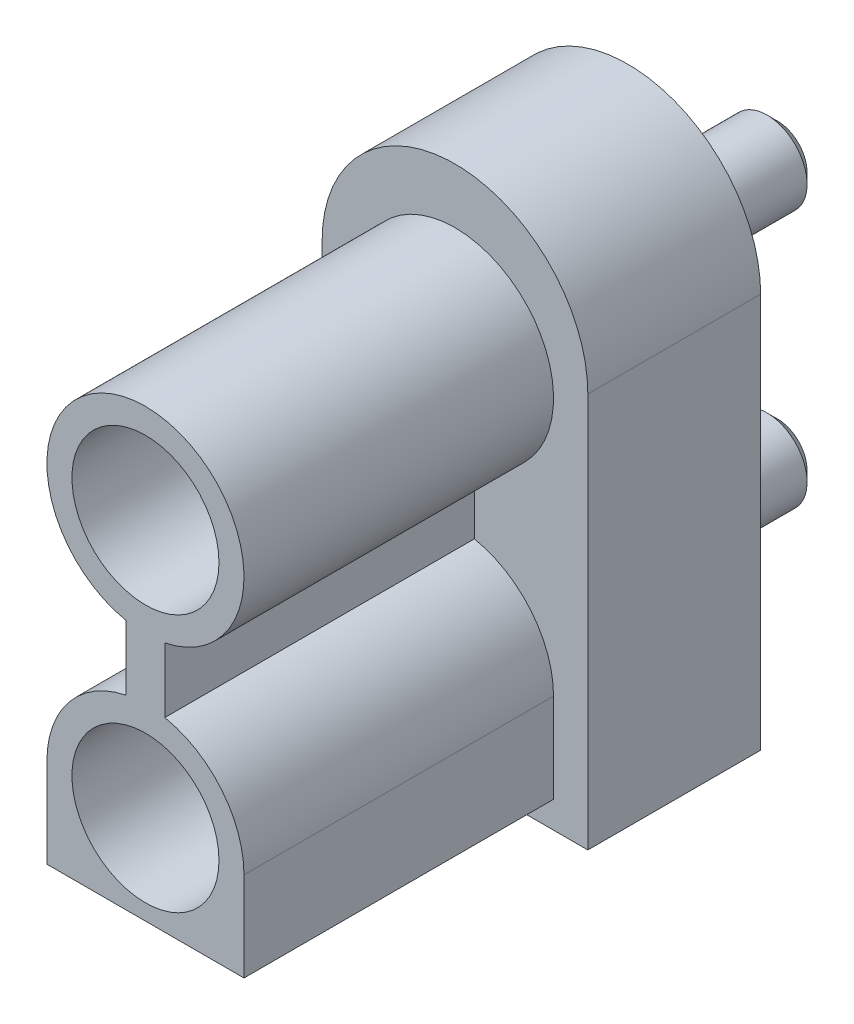
ISO-10303-21;
HEADER;
FILE_DESCRIPTION(('STEP AP214'),'2;1');
FILE_NAME('part.step','',(''),(''),'','','');
FILE_SCHEMA(('AUTOMOTIVE_DESIGN { 1 0 10303 214 1 1 1 1 }'));
ENDSEC;
DATA;
#1=APPLICATION_CONTEXT('core data for automotive mechanical design processes');
#2=APPLICATION_PROTOCOL_DEFINITION('international standard','automotive_design',2000,#1);
#3=PRODUCT_CONTEXT('',#1,'mechanical');
#4=PRODUCT('Part','Part','',(#3));
#5=PRODUCT_RELATED_PRODUCT_CATEGORY('part','',(#4));
#6=PRODUCT_DEFINITION_FORMATION('','',#4);
#7=PRODUCT_DEFINITION_CONTEXT('part definition',#1,'design');
#8=PRODUCT_DEFINITION('design','',#6,#7);
#9=PRODUCT_DEFINITION_SHAPE('','',#8);
#10=(LENGTH_UNIT() NAMED_UNIT(*) SI_UNIT(.MILLI.,.METRE.));
#11=(NAMED_UNIT(*) PLANE_ANGLE_UNIT() SI_UNIT($,.RADIAN.));
#12=(NAMED_UNIT(*) SI_UNIT($,.STERADIAN.) SOLID_ANGLE_UNIT());
#13=UNCERTAINTY_MEASURE_WITH_UNIT(LENGTH_MEASURE(1.E-05),#10,'distance_accuracy_value','');
#14=(GEOMETRIC_REPRESENTATION_CONTEXT(3) GLOBAL_UNCERTAINTY_ASSIGNED_CONTEXT((#13)) GLOBAL_UNIT_ASSIGNED_CONTEXT((#10,
#11,#12)) REPRESENTATION_CONTEXT('',''));
#15=CARTESIAN_POINT('',(0.,0.,0.));
#16=DIRECTION('',(0.,0.,1.));
#17=DIRECTION('',(1.,0.,0.));
#18=AXIS2_PLACEMENT_3D('',#15,#16,#17);
#19=CARTESIAN_POINT('',(0.,7.655,3.35));
#20=DIRECTION('',(0.,0.,-1.));
#21=DIRECTION('',(-1.,0.,0.));
#22=AXIS2_PLACEMENT_3D('',#19,#20,#21);
#23=CYLINDRICAL_SURFACE('',#22,2.575);
#24=CARTESIAN_POINT('',(0.,7.655,0.));
#25=DIRECTION('',(0.,0.,1.));
#26=DIRECTION('',(-1.,0.,0.));
#27=AXIS2_PLACEMENT_3D('',#24,#25,#26);
#28=CIRCLE('',#27,2.575);
#29=CARTESIAN_POINT('',(2.575,7.655,0.));
#30=VERTEX_POINT('',#29);
#31=CARTESIAN_POINT('',(-2.575,7.655,0.));
#32=VERTEX_POINT('',#31);
#33=EDGE_CURVE('E173',#30,#32,#28,.T.);
#34=ORIENTED_EDGE('',*,*,#33,.T.);
#35=DIRECTION('',(0.,0.,-1.));
#36=VECTOR('',#35,1.);
#37=CARTESIAN_POINT('',(-2.575,7.655,3.35));
#38=LINE('',#37,#36);
#39=CARTESIAN_POINT('',(-2.575,7.655,3.35));
#40=VERTEX_POINT('',#39);
#41=EDGE_CURVE('E211',#40,#32,#38,.T.);
#42=ORIENTED_EDGE('',*,*,#41,.F.);
#43=CARTESIAN_POINT('',(0.,7.655,3.35));
#44=DIRECTION('',(0.,0.,1.));
#45=DIRECTION('',(-1.,0.,0.));
#46=AXIS2_PLACEMENT_3D('',#43,#44,#45);
#47=CIRCLE('',#46,2.575);
#48=CARTESIAN_POINT('',(2.575,7.655,3.35));
#49=VERTEX_POINT('',#48);
#50=EDGE_CURVE('E174',#49,#40,#47,.T.);
#51=ORIENTED_EDGE('',*,*,#50,.F.);
#52=DIRECTION('',(0.,0.,-1.));
#53=VECTOR('',#52,1.);
#54=CARTESIAN_POINT('',(2.575,7.655,3.35));
#55=LINE('',#54,#53);
#56=EDGE_CURVE('E188',#49,#30,#55,.T.);
#57=ORIENTED_EDGE('',*,*,#56,.T.);
#58=EDGE_LOOP('',(#34,#42,#51,#57));
#59=FACE_BOUND('',#58,.T.);
#60=ADVANCED_FACE('F43',(#59),#23,.T.);
#61=CARTESIAN_POINT('',(-2.575,7.655,3.35));
#62=DIRECTION('',(1.,0.,0.));
#63=DIRECTION('',(0.,1.,0.));
#64=AXIS2_PLACEMENT_3D('',#61,#62,#63);
#65=PLANE('',#64);
#66=DIRECTION('',(0.,-1.,0.));
#67=VECTOR('',#66,1.);
#68=CARTESIAN_POINT('',(-2.575,7.655,0.));
#69=LINE('',#68,#67);
#70=CARTESIAN_POINT('',(-2.575,0.,0.));
#71=VERTEX_POINT('',#70);
#72=EDGE_CURVE('E192',#32,#71,#69,.T.);
#73=ORIENTED_EDGE('',*,*,#72,.T.);
#74=DIRECTION('',(0.,0.,-1.));
#75=VECTOR('',#74,1.);
#76=CARTESIAN_POINT('',(-2.575,0.,3.35));
#77=LINE('',#76,#75);
#78=CARTESIAN_POINT('',(-2.575,0.,3.35));
#79=VERTEX_POINT('',#78);
#80=EDGE_CURVE('E207',#79,#71,#77,.T.);
#81=ORIENTED_EDGE('',*,*,#80,.F.);
#82=DIRECTION('',(0.,-1.,0.));
#83=VECTOR('',#82,1.);
#84=CARTESIAN_POINT('',(-2.575,7.655,3.35));
#85=LINE('',#84,#83);
#86=EDGE_CURVE('E178',#40,#79,#85,.T.);
#87=ORIENTED_EDGE('',*,*,#86,.F.);
#88=ORIENTED_EDGE('',*,*,#41,.T.);
#89=EDGE_LOOP('',(#73,#81,#87,#88));
#90=FACE_BOUND('',#89,.T.);
#91=ADVANCED_FACE('F240',(#90),#65,.F.);
#92=CARTESIAN_POINT('',(-2.575,0.,3.35));
#93=DIRECTION('',(0.,1.,0.));
#94=DIRECTION('',(0.,0.,1.));
#95=AXIS2_PLACEMENT_3D('',#92,#93,#94);
#96=PLANE('',#95);
#97=DIRECTION('',(1.,0.,0.));
#98=VECTOR('',#97,1.);
#99=CARTESIAN_POINT('',(-2.575,0.,0.));
#100=LINE('',#99,#98);
#101=CARTESIAN_POINT('',(2.575,0.,0.));
#102=VERTEX_POINT('',#101);
#103=EDGE_CURVE('E195',#71,#102,#100,.T.);
#104=ORIENTED_EDGE('',*,*,#103,.T.);
#105=DIRECTION('',(0.,0.,-1.));
#106=VECTOR('',#105,1.);
#107=CARTESIAN_POINT('',(2.575,0.,3.35));
#108=LINE('',#107,#106);
#109=CARTESIAN_POINT('',(2.575,0.,3.35));
#110=VERTEX_POINT('',#109);
#111=EDGE_CURVE('E203',#110,#102,#108,.T.);
#112=ORIENTED_EDGE('',*,*,#111,.F.);
#113=DIRECTION('',(1.,0.,0.));
#114=VECTOR('',#113,1.);
#115=CARTESIAN_POINT('',(-2.575,0.,3.35));
#116=LINE('',#115,#114);
#117=EDGE_CURVE('E182',#79,#110,#116,.T.);
#118=ORIENTED_EDGE('',*,*,#117,.F.);
#119=ORIENTED_EDGE('',*,*,#80,.T.);
#120=EDGE_LOOP('',(#104,#112,#118,#119));
#121=FACE_BOUND('',#120,.T.);
#122=ADVANCED_FACE('F246',(#121),#96,.F.);
#123=CARTESIAN_POINT('',(2.575,0.,3.35));
#124=DIRECTION('',(-1.,0.,0.));
#125=DIRECTION('',(0.,-1.,0.));
#126=AXIS2_PLACEMENT_3D('',#123,#124,#125);
#127=PLANE('',#126);
#128=DIRECTION('',(0.,1.,0.));
#129=VECTOR('',#128,1.);
#130=CARTESIAN_POINT('',(2.575,0.,0.));
#131=LINE('',#130,#129);
#132=EDGE_CURVE('E179',#102,#30,#131,.T.);
#133=ORIENTED_EDGE('',*,*,#132,.T.);
#134=ORIENTED_EDGE('',*,*,#56,.F.);
#135=DIRECTION('',(0.,1.,0.));
#136=VECTOR('',#135,1.);
#137=CARTESIAN_POINT('',(2.575,0.,3.35));
#138=LINE('',#137,#136);
#139=EDGE_CURVE('E185',#110,#49,#138,.T.);
#140=ORIENTED_EDGE('',*,*,#139,.F.);
#141=ORIENTED_EDGE('',*,*,#111,.T.);
#142=EDGE_LOOP('',(#133,#134,#140,#141));
#143=FACE_BOUND('',#142,.T.);
#144=ADVANCED_FACE('F257',(#143),#127,.F.);
#145=CARTESIAN_POINT('',(0.,7.655,3.35));
#146=DIRECTION('',(0.,0.,-1.));
#147=DIRECTION('',(-1.,0.,0.));
#148=AXIS2_PLACEMENT_3D('',#145,#146,#147);
#149=PLANE('',#148);
#150=CARTESIAN_POINT('',(0.,2.25,3.35));
#151=DIRECTION('',(0.,0.,1.));
#152=DIRECTION('',(-1.,0.,0.));
#153=AXIS2_PLACEMENT_3D('',#150,#151,#152);
#154=CIRCLE('',#153,1.91);
#155=CARTESIAN_POINT('',(-0.375,4.12282540563716,3.35));
#156=VERTEX_POINT('',#155);
#157=CARTESIAN_POINT('',(-1.91,2.25,3.35));
#158=VERTEX_POINT('',#157);
#159=EDGE_CURVE('E157',#156,#158,#154,.T.);
#160=ORIENTED_EDGE('',*,*,#159,.F.);
#161=DIRECTION('',(0.,-1.,0.));
#162=VECTOR('',#161,1.);
#163=CARTESIAN_POINT('',(-0.375,5.37717459436284,3.35));
#164=LINE('',#163,#162);
#165=CARTESIAN_POINT('',(-0.375,5.37717459436284,3.35));
#166=VERTEX_POINT('',#165);
#167=EDGE_CURVE('E154',#166,#156,#164,.T.);
#168=ORIENTED_EDGE('',*,*,#167,.F.);
#169=CARTESIAN_POINT('',(0.,7.25,3.35));
#170=DIRECTION('',(0.,0.,1.));
#171=DIRECTION('',(1.,0.,0.));
#172=AXIS2_PLACEMENT_3D('',#169,#170,#171);
#173=CIRCLE('',#172,1.91);
#174=CARTESIAN_POINT('',(0.375,5.37717459436284,3.35));
#175=VERTEX_POINT('',#174);
#176=EDGE_CURVE('E379',#175,#166,#173,.T.);
#177=ORIENTED_EDGE('',*,*,#176,.F.);
#178=DIRECTION('',(0.,1.,0.));
#179=VECTOR('',#178,1.);
#180=CARTESIAN_POINT('',(0.375,5.37717459436284,3.35));
#181=LINE('',#180,#179);
#182=CARTESIAN_POINT('',(0.375000000000001,4.12282540563716,3.35));
#183=VERTEX_POINT('',#182);
#184=EDGE_CURVE('E375',#183,#175,#181,.T.);
#185=ORIENTED_EDGE('',*,*,#184,.F.);
#186=CARTESIAN_POINT('',(0.,2.25,3.35));
#187=DIRECTION('',(0.,0.,1.));
#188=DIRECTION('',(-1.,0.,0.));
#189=AXIS2_PLACEMENT_3D('',#186,#187,#188);
#190=CIRCLE('',#189,1.91);
#191=CARTESIAN_POINT('',(1.91,2.25,3.35));
#192=VERTEX_POINT('',#191);
#193=EDGE_CURVE('E371',#192,#183,#190,.T.);
#194=ORIENTED_EDGE('',*,*,#193,.F.);
#195=DIRECTION('',(0.,1.,0.));
#196=VECTOR('',#195,1.);
#197=CARTESIAN_POINT('',(1.91,0.518598550380402,3.35));
#198=LINE('',#197,#196);
#199=CARTESIAN_POINT('',(1.91,0.518598550380402,3.35));
#200=VERTEX_POINT('',#199);
#201=EDGE_CURVE('E367',#200,#192,#198,.T.);
#202=ORIENTED_EDGE('',*,*,#201,.F.);
#203=DIRECTION('',(1.,0.,0.));
#204=VECTOR('',#203,1.);
#205=CARTESIAN_POINT('',(-1.91,0.518598550380402,3.35));
#206=LINE('',#205,#204);
#207=CARTESIAN_POINT('',(-1.91,0.518598550380402,3.35));
#208=VERTEX_POINT('',#207);
#209=EDGE_CURVE('E65',#208,#200,#206,.T.);
#210=ORIENTED_EDGE('',*,*,#209,.F.);
#211=DIRECTION('',(0.,-1.,0.));
#212=VECTOR('',#211,1.);
#213=CARTESIAN_POINT('',(-1.91,2.25,3.35));
#214=LINE('',#213,#212);
#215=EDGE_CURVE('E60',#158,#208,#214,.T.);
#216=ORIENTED_EDGE('',*,*,#215,.F.);
#217=EDGE_LOOP('',(#160,#168,#177,#185,#194,#202,#210,#216));
#218=FACE_BOUND('',#217,.T.);
#219=ORIENTED_EDGE('',*,*,#50,.T.);
#220=ORIENTED_EDGE('',*,*,#86,.T.);
#221=ORIENTED_EDGE('',*,*,#117,.T.);
#222=ORIENTED_EDGE('',*,*,#139,.T.);
#223=EDGE_LOOP('',(#219,#220,#221,#222));
#224=FACE_BOUND('',#223,.T.);
#225=ADVANCED_FACE('F261',(#218,#224),#149,.F.);
#226=CARTESIAN_POINT('',(0.,7.655,0.));
#227=DIRECTION('',(0.,0.,-1.));
#228=DIRECTION('',(-1.,0.,0.));
#229=AXIS2_PLACEMENT_3D('',#226,#227,#228);
#230=PLANE('',#229);
#231=CARTESIAN_POINT('',(0.,2.25,0.));
#232=DIRECTION('',(0.,0.,-1.));
#233=DIRECTION('',(-1.,0.,0.));
#234=AXIS2_PLACEMENT_3D('',#231,#232,#233);
#235=CIRCLE('',#234,0.775);
#236=CARTESIAN_POINT('',(-0.775,2.25,0.));
#237=VERTEX_POINT('',#236);
#238=EDGE_CURVE('E159',#237,#237,#235,.T.);
#239=ORIENTED_EDGE('',*,*,#238,.F.);
#240=EDGE_LOOP('',(#239));
#241=FACE_BOUND('',#240,.T.);
#242=CARTESIAN_POINT('',(0.,7.25,0.));
#243=DIRECTION('',(0.,0.,-1.));
#244=DIRECTION('',(-1.,0.,0.));
#245=AXIS2_PLACEMENT_3D('',#242,#243,#244);
#246=CIRCLE('',#245,0.775);
#247=CARTESIAN_POINT('',(-0.775,7.25,0.));
#248=VERTEX_POINT('',#247);
#249=EDGE_CURVE('E164',#248,#248,#246,.T.);
#250=ORIENTED_EDGE('',*,*,#249,.F.);
#251=EDGE_LOOP('',(#250));
#252=FACE_BOUND('',#251,.T.);
#253=ORIENTED_EDGE('',*,*,#33,.F.);
#254=ORIENTED_EDGE('',*,*,#132,.F.);
#255=ORIENTED_EDGE('',*,*,#103,.F.);
#256=ORIENTED_EDGE('',*,*,#72,.F.);
#257=EDGE_LOOP('',(#253,#254,#255,#256));
#258=FACE_BOUND('',#257,.T.);
#259=ADVANCED_FACE('F263',(#241,#252,#258),#230,.T.);
#260=CARTESIAN_POINT('',(0.,7.25,-2.9));
#261=DIRECTION('',(0.,0.,1.));
#262=DIRECTION('',(1.,0.,0.));
#263=AXIS2_PLACEMENT_3D('',#260,#261,#262);
#264=CYLINDRICAL_SURFACE('',#263,0.775);
#265=CARTESIAN_POINT('',(0.,7.25,-2.7));
#266=DIRECTION('',(0.,0.,-1.));
#267=DIRECTION('',(-1.,0.,0.));
#268=AXIS2_PLACEMENT_3D('',#265,#266,#267);
#269=CIRCLE('',#268,0.775);
#270=CARTESIAN_POINT('',(-0.775,7.25,-2.7));
#271=VERTEX_POINT('',#270);
#272=EDGE_CURVE('E11',#271,#271,#269,.F.);
#273=ORIENTED_EDGE('',*,*,#272,.T.);
#274=EDGE_LOOP('',(#273));
#275=FACE_BOUND('',#274,.T.);
#276=ORIENTED_EDGE('',*,*,#249,.T.);
#277=EDGE_LOOP('',(#276));
#278=FACE_BOUND('',#277,.T.);
#279=ADVANCED_FACE('F266',(#275,#278),#264,.T.);
#280=CARTESIAN_POINT('',(0.,7.25,-2.9));
#281=DIRECTION('',(0.,0.,-1.));
#282=DIRECTION('',(-1.,0.,0.));
#283=AXIS2_PLACEMENT_3D('',#280,#281,#282);
#284=PLANE('',#283);
#285=CARTESIAN_POINT('',(0.,7.25,-2.9));
#286=DIRECTION('',(0.,0.,-1.));
#287=DIRECTION('',(-1.,0.,0.));
#288=AXIS2_PLACEMENT_3D('',#285,#286,#287);
#289=CIRCLE('',#288,0.574999999999999);
#290=CARTESIAN_POINT('',(-0.574999999999999,7.25,-2.9));
#291=VERTEX_POINT('',#290);
#292=EDGE_CURVE('E53',#291,#291,#289,.T.);
#293=ORIENTED_EDGE('',*,*,#292,.T.);
#294=EDGE_LOOP('',(#293));
#295=FACE_BOUND('',#294,.T.);
#296=ADVANCED_FACE('F226',(#295),#284,.T.);
#297=CARTESIAN_POINT('',(0.,2.25,-2.9));
#298=DIRECTION('',(0.,0.,1.));
#299=DIRECTION('',(1.,0.,0.));
#300=AXIS2_PLACEMENT_3D('',#297,#298,#299);
#301=CYLINDRICAL_SURFACE('',#300,0.775);
#302=CARTESIAN_POINT('',(0.,2.25,-2.7));
#303=DIRECTION('',(0.,0.,-1.));
#304=DIRECTION('',(-1.,0.,0.));
#305=AXIS2_PLACEMENT_3D('',#302,#303,#304);
#306=CIRCLE('',#305,0.775);
#307=CARTESIAN_POINT('',(-0.775,2.25,-2.7));
#308=VERTEX_POINT('',#307);
#309=EDGE_CURVE('E219',#308,#308,#306,.F.);
#310=ORIENTED_EDGE('',*,*,#309,.T.);
#311=EDGE_LOOP('',(#310));
#312=FACE_BOUND('',#311,.T.);
#313=ORIENTED_EDGE('',*,*,#238,.T.);
#314=EDGE_LOOP('',(#313));
#315=FACE_BOUND('',#314,.T.);
#316=ADVANCED_FACE('F277',(#312,#315),#301,.T.);
#317=CARTESIAN_POINT('',(0.,2.25,-2.9));
#318=DIRECTION('',(0.,0.,-1.));
#319=DIRECTION('',(-1.,0.,0.));
#320=AXIS2_PLACEMENT_3D('',#317,#318,#319);
#321=PLANE('',#320);
#322=CARTESIAN_POINT('',(0.,2.25,-2.9));
#323=DIRECTION('',(0.,0.,-1.));
#324=DIRECTION('',(-1.,0.,0.));
#325=AXIS2_PLACEMENT_3D('',#322,#323,#324);
#326=CIRCLE('',#325,0.575000000000001);
#327=CARTESIAN_POINT('',(-0.575000000000001,2.25,-2.9));
#328=VERTEX_POINT('',#327);
#329=EDGE_CURVE('E215',#328,#328,#326,.T.);
#330=ORIENTED_EDGE('',*,*,#329,.T.);
#331=EDGE_LOOP('',(#330));
#332=FACE_BOUND('',#331,.T.);
#333=ADVANCED_FACE('F236',(#332),#321,.T.);
#334=CARTESIAN_POINT('',(0.,2.25,-2.9));
#335=DIRECTION('',(0.,0.,1.));
#336=DIRECTION('',(1.,0.,0.));
#337=AXIS2_PLACEMENT_3D('',#334,#335,#336);
#338=CONICAL_SURFACE('',#337,0.575000000000001,0.785398163397447);
#339=ORIENTED_EDGE('',*,*,#309,.F.);
#340=EDGE_LOOP('',(#339));
#341=FACE_BOUND('',#340,.T.);
#342=ORIENTED_EDGE('',*,*,#329,.F.);
#343=EDGE_LOOP('',(#342));
#344=FACE_BOUND('',#343,.T.);
#345=ADVANCED_FACE('F229',(#341,#344),#338,.T.);
#346=CARTESIAN_POINT('',(0.,7.25,-2.9));
#347=DIRECTION('',(0.,0.,1.));
#348=DIRECTION('',(1.,0.,0.));
#349=AXIS2_PLACEMENT_3D('',#346,#347,#348);
#350=CONICAL_SURFACE('',#349,0.574999999999999,0.785398163397446);
#351=ORIENTED_EDGE('',*,*,#272,.F.);
#352=EDGE_LOOP('',(#351));
#353=FACE_BOUND('',#352,.T.);
#354=ORIENTED_EDGE('',*,*,#292,.F.);
#355=EDGE_LOOP('',(#354));
#356=FACE_BOUND('',#355,.T.);
#357=ADVANCED_FACE('F46',(#353,#356),#350,.T.);
#358=CARTESIAN_POINT('',(0.,2.25,9.35));
#359=DIRECTION('',(0.,0.,-1.));
#360=DIRECTION('',(-1.,0.,0.));
#361=AXIS2_PLACEMENT_3D('',#358,#359,#360);
#362=PLANE('',#361);
#363=CARTESIAN_POINT('',(0.,2.25,9.35));
#364=DIRECTION('',(0.,0.,1.));
#365=DIRECTION('',(-1.,0.,0.));
#366=AXIS2_PLACEMENT_3D('',#363,#364,#365);
#367=CIRCLE('',#366,1.91);
#368=CARTESIAN_POINT('',(-0.375,4.12282540563716,9.35));
#369=VERTEX_POINT('',#368);
#370=CARTESIAN_POINT('',(-1.91,2.25,9.35));
#371=VERTEX_POINT('',#370);
#372=EDGE_CURVE('E143',#369,#371,#367,.T.);
#373=ORIENTED_EDGE('',*,*,#372,.T.);
#374=DIRECTION('',(0.,-1.,0.));
#375=VECTOR('',#374,1.);
#376=CARTESIAN_POINT('',(-1.91,2.25,9.35));
#377=LINE('',#376,#375);
#378=CARTESIAN_POINT('',(-1.91,0.518598550380402,9.35));
#379=VERTEX_POINT('',#378);
#380=EDGE_CURVE('E131',#371,#379,#377,.T.);
#381=ORIENTED_EDGE('',*,*,#380,.T.);
#382=DIRECTION('',(1.,0.,0.));
#383=VECTOR('',#382,1.);
#384=CARTESIAN_POINT('',(-1.91,0.518598550380402,9.35));
#385=LINE('',#384,#383);
#386=CARTESIAN_POINT('',(1.91,0.518598550380402,9.35));
#387=VERTEX_POINT('',#386);
#388=EDGE_CURVE('E142',#379,#387,#385,.T.);
#389=ORIENTED_EDGE('',*,*,#388,.T.);
#390=DIRECTION('',(0.,1.,0.));
#391=VECTOR('',#390,1.);
#392=CARTESIAN_POINT('',(1.91,0.518598550380402,9.35));
#393=LINE('',#392,#391);
#394=CARTESIAN_POINT('',(1.91,2.25,9.35));
#395=VERTEX_POINT('',#394);
#396=EDGE_CURVE('E346',#387,#395,#393,.T.);
#397=ORIENTED_EDGE('',*,*,#396,.T.);
#398=CARTESIAN_POINT('',(0.,2.25,9.35));
#399=DIRECTION('',(0.,0.,1.));
#400=DIRECTION('',(-1.,0.,0.));
#401=AXIS2_PLACEMENT_3D('',#398,#399,#400);
#402=CIRCLE('',#401,1.91);
#403=CARTESIAN_POINT('',(0.375000000000001,4.12282540563716,9.35));
#404=VERTEX_POINT('',#403);
#405=EDGE_CURVE('E349',#395,#404,#402,.T.);
#406=ORIENTED_EDGE('',*,*,#405,.T.);
#407=DIRECTION('',(0.,1.,0.));
#408=VECTOR('',#407,1.);
#409=CARTESIAN_POINT('',(0.375,5.37717459436284,9.35));
#410=LINE('',#409,#408);
#411=CARTESIAN_POINT('',(0.375,5.37717459436284,9.35));
#412=VERTEX_POINT('',#411);
#413=EDGE_CURVE('E352',#404,#412,#410,.T.);
#414=ORIENTED_EDGE('',*,*,#413,.T.);
#415=CARTESIAN_POINT('',(0.,7.25,9.35));
#416=DIRECTION('',(0.,0.,1.));
#417=DIRECTION('',(1.,0.,0.));
#418=AXIS2_PLACEMENT_3D('',#415,#416,#417);
#419=CIRCLE('',#418,1.91);
#420=CARTESIAN_POINT('',(-0.375,5.37717459436284,9.35));
#421=VERTEX_POINT('',#420);
#422=EDGE_CURVE('E355',#412,#421,#419,.T.);
#423=ORIENTED_EDGE('',*,*,#422,.T.);
#424=DIRECTION('',(0.,-1.,0.));
#425=VECTOR('',#424,1.);
#426=CARTESIAN_POINT('',(-0.375,5.37717459436284,9.35));
#427=LINE('',#426,#425);
#428=EDGE_CURVE('E149',#421,#369,#427,.T.);
#429=ORIENTED_EDGE('',*,*,#428,.T.);
#430=EDGE_LOOP('',(#373,#381,#389,#397,#406,#414,#423,#429));
#431=FACE_BOUND('',#430,.T.);
#432=CARTESIAN_POINT('',(0.,2.25,9.35));
#433=DIRECTION('',(0.,0.,1.));
#434=DIRECTION('',(1.,0.,0.));
#435=AXIS2_PLACEMENT_3D('',#432,#433,#434);
#436=CIRCLE('',#435,1.425);
#437=CARTESIAN_POINT('',(1.425,2.25,9.35));
#438=VERTEX_POINT('',#437);
#439=EDGE_CURVE('E337',#438,#438,#436,.T.);
#440=ORIENTED_EDGE('',*,*,#439,.F.);
#441=EDGE_LOOP('',(#440));
#442=FACE_BOUND('',#441,.T.);
#443=CARTESIAN_POINT('',(0.,7.25,9.35));
#444=DIRECTION('',(0.,0.,1.));
#445=DIRECTION('',(1.,0.,0.));
#446=AXIS2_PLACEMENT_3D('',#443,#444,#445);
#447=CIRCLE('',#446,1.425);
#448=CARTESIAN_POINT('',(1.425,7.25,9.35));
#449=VERTEX_POINT('',#448);
#450=EDGE_CURVE('E326',#449,#449,#447,.T.);
#451=ORIENTED_EDGE('',*,*,#450,.F.);
#452=EDGE_LOOP('',(#451));
#453=FACE_BOUND('',#452,.T.);
#454=ADVANCED_FACE('F146',(#431,#442,#453),#362,.F.);
#455=CARTESIAN_POINT('',(0.,2.25,9.35));
#456=DIRECTION('',(0.,0.,-1.));
#457=DIRECTION('',(-1.,0.,0.));
#458=AXIS2_PLACEMENT_3D('',#455,#456,#457);
#459=CYLINDRICAL_SURFACE('',#458,1.91);
#460=ORIENTED_EDGE('',*,*,#159,.T.);
#461=DIRECTION('',(0.,0.,-1.));
#462=VECTOR('',#461,1.);
#463=CARTESIAN_POINT('',(-1.91,2.25,9.35));
#464=LINE('',#463,#462);
#465=EDGE_CURVE('E135',#371,#158,#464,.T.);
#466=ORIENTED_EDGE('',*,*,#465,.F.);
#467=ORIENTED_EDGE('',*,*,#372,.F.);
#468=DIRECTION('',(0.,0.,-1.));
#469=VECTOR('',#468,1.);
#470=CARTESIAN_POINT('',(-0.375,4.12282540563716,9.35));
#471=LINE('',#470,#469);
#472=EDGE_CURVE('E360',#369,#156,#471,.T.);
#473=ORIENTED_EDGE('',*,*,#472,.T.);
#474=EDGE_LOOP('',(#460,#466,#467,#473));
#475=FACE_BOUND('',#474,.T.);
#476=ADVANCED_FACE('F156',(#475),#459,.T.);
#477=CARTESIAN_POINT('',(-1.91,2.25,9.35));
#478=DIRECTION('',(1.,0.,0.));
#479=DIRECTION('',(0.,1.,0.));
#480=AXIS2_PLACEMENT_3D('',#477,#478,#479);
#481=PLANE('',#480);
#482=ORIENTED_EDGE('',*,*,#215,.T.);
#483=DIRECTION('',(0.,0.,-1.));
#484=VECTOR('',#483,1.);
#485=CARTESIAN_POINT('',(-1.91,0.518598550380402,9.35));
#486=LINE('',#485,#484);
#487=EDGE_CURVE('E138',#379,#208,#486,.T.);
#488=ORIENTED_EDGE('',*,*,#487,.F.);
#489=ORIENTED_EDGE('',*,*,#380,.F.);
#490=ORIENTED_EDGE('',*,*,#465,.T.);
#491=EDGE_LOOP('',(#482,#488,#489,#490));
#492=FACE_BOUND('',#491,.T.);
#493=ADVANCED_FACE('F133',(#492),#481,.F.);
#494=CARTESIAN_POINT('',(-1.91,0.518598550380402,9.35));
#495=DIRECTION('',(0.,1.,0.));
#496=DIRECTION('',(0.,0.,1.));
#497=AXIS2_PLACEMENT_3D('',#494,#495,#496);
#498=PLANE('',#497);
#499=ORIENTED_EDGE('',*,*,#209,.T.);
#500=DIRECTION('',(0.,0.,-1.));
#501=VECTOR('',#500,1.);
#502=CARTESIAN_POINT('',(1.91,0.518598550380402,9.35));
#503=LINE('',#502,#501);
#504=EDGE_CURVE('E166',#387,#200,#503,.T.);
#505=ORIENTED_EDGE('',*,*,#504,.F.);
#506=ORIENTED_EDGE('',*,*,#388,.F.);
#507=ORIENTED_EDGE('',*,*,#487,.T.);
#508=EDGE_LOOP('',(#499,#505,#506,#507));
#509=FACE_BOUND('',#508,.T.);
#510=ADVANCED_FACE('F288',(#509),#498,.F.);
#511=CARTESIAN_POINT('',(1.91,0.518598550380402,9.35));
#512=DIRECTION('',(-1.,0.,0.));
#513=DIRECTION('',(0.,-1.,0.));
#514=AXIS2_PLACEMENT_3D('',#511,#512,#513);
#515=PLANE('',#514);
#516=ORIENTED_EDGE('',*,*,#201,.T.);
#517=DIRECTION('',(0.,0.,-1.));
#518=VECTOR('',#517,1.);
#519=CARTESIAN_POINT('',(1.91,2.25,9.35));
#520=LINE('',#519,#518);
#521=EDGE_CURVE('E400',#395,#192,#520,.T.);
#522=ORIENTED_EDGE('',*,*,#521,.F.);
#523=ORIENTED_EDGE('',*,*,#396,.F.);
#524=ORIENTED_EDGE('',*,*,#504,.T.);
#525=EDGE_LOOP('',(#516,#522,#523,#524));
#526=FACE_BOUND('',#525,.T.);
#527=ADVANCED_FACE('F291',(#526),#515,.F.);
#528=CARTESIAN_POINT('',(0.,2.25,9.35));
#529=DIRECTION('',(0.,0.,-1.));
#530=DIRECTION('',(-1.,0.,0.));
#531=AXIS2_PLACEMENT_3D('',#528,#529,#530);
#532=CYLINDRICAL_SURFACE('',#531,1.91);
#533=ORIENTED_EDGE('',*,*,#193,.T.);
#534=DIRECTION('',(0.,0.,-1.));
#535=VECTOR('',#534,1.);
#536=CARTESIAN_POINT('',(0.375000000000001,4.12282540563716,9.35));
#537=LINE('',#536,#535);
#538=EDGE_CURVE('E396',#404,#183,#537,.T.);
#539=ORIENTED_EDGE('',*,*,#538,.F.);
#540=ORIENTED_EDGE('',*,*,#405,.F.);
#541=ORIENTED_EDGE('',*,*,#521,.T.);
#542=EDGE_LOOP('',(#533,#539,#540,#541));
#543=FACE_BOUND('',#542,.T.);
#544=ADVANCED_FACE('F295',(#543),#532,.T.);
#545=CARTESIAN_POINT('',(0.375,5.37717459436284,9.35));
#546=DIRECTION('',(-1.,0.,0.));
#547=DIRECTION('',(0.,-1.,0.));
#548=AXIS2_PLACEMENT_3D('',#545,#546,#547);
#549=PLANE('',#548);
#550=ORIENTED_EDGE('',*,*,#184,.T.);
#551=DIRECTION('',(0.,0.,-1.));
#552=VECTOR('',#551,1.);
#553=CARTESIAN_POINT('',(0.375,5.37717459436284,9.35));
#554=LINE('',#553,#552);
#555=EDGE_CURVE('E392',#412,#175,#554,.T.);
#556=ORIENTED_EDGE('',*,*,#555,.F.);
#557=ORIENTED_EDGE('',*,*,#413,.F.);
#558=ORIENTED_EDGE('',*,*,#538,.T.);
#559=EDGE_LOOP('',(#550,#556,#557,#558));
#560=FACE_BOUND('',#559,.T.);
#561=ADVANCED_FACE('F299',(#560),#549,.F.);
#562=CARTESIAN_POINT('',(0.,7.25,9.35));
#563=DIRECTION('',(0.,0.,-1.));
#564=DIRECTION('',(-1.,0.,0.));
#565=AXIS2_PLACEMENT_3D('',#562,#563,#564);
#566=CYLINDRICAL_SURFACE('',#565,1.91);
#567=ORIENTED_EDGE('',*,*,#176,.T.);
#568=DIRECTION('',(0.,0.,-1.));
#569=VECTOR('',#568,1.);
#570=CARTESIAN_POINT('',(-0.375,5.37717459436284,9.35));
#571=LINE('',#570,#569);
#572=EDGE_CURVE('E388',#421,#166,#571,.T.);
#573=ORIENTED_EDGE('',*,*,#572,.F.);
#574=ORIENTED_EDGE('',*,*,#422,.F.);
#575=ORIENTED_EDGE('',*,*,#555,.T.);
#576=EDGE_LOOP('',(#567,#573,#574,#575));
#577=FACE_BOUND('',#576,.T.);
#578=ADVANCED_FACE('F303',(#577),#566,.T.);
#579=CARTESIAN_POINT('',(-0.375,5.37717459436284,9.35));
#580=DIRECTION('',(1.,0.,0.));
#581=DIRECTION('',(0.,1.,0.));
#582=AXIS2_PLACEMENT_3D('',#579,#580,#581);
#583=PLANE('',#582);
#584=ORIENTED_EDGE('',*,*,#167,.T.);
#585=ORIENTED_EDGE('',*,*,#472,.F.);
#586=ORIENTED_EDGE('',*,*,#428,.F.);
#587=ORIENTED_EDGE('',*,*,#572,.T.);
#588=EDGE_LOOP('',(#584,#585,#586,#587));
#589=FACE_BOUND('',#588,.T.);
#590=ADVANCED_FACE('F307',(#589),#583,.F.);
#591=CARTESIAN_POINT('',(0.,2.25,9.35));
#592=DIRECTION('',(0.,0.,-1.));
#593=DIRECTION('',(-1.,0.,0.));
#594=AXIS2_PLACEMENT_3D('',#591,#592,#593);
#595=CYLINDRICAL_SURFACE('',#594,1.425);
#596=ORIENTED_EDGE('',*,*,#439,.T.);
#597=EDGE_LOOP('',(#596));
#598=FACE_BOUND('',#597,.T.);
#599=CARTESIAN_POINT('',(0.,2.25,3.35));
#600=DIRECTION('',(0.,0.,1.));
#601=DIRECTION('',(1.,0.,0.));
#602=AXIS2_PLACEMENT_3D('',#599,#600,#601);
#603=CIRCLE('',#602,1.425);
#604=CARTESIAN_POINT('',(1.425,2.25,3.35));
#605=VERTEX_POINT('',#604);
#606=EDGE_CURVE('E334',#605,#605,#603,.T.);
#607=ORIENTED_EDGE('',*,*,#606,.F.);
#608=EDGE_LOOP('',(#607));
#609=FACE_BOUND('',#608,.T.);
#610=ADVANCED_FACE('F310',(#598,#609),#595,.F.);
#611=CARTESIAN_POINT('',(0.,7.25,9.35));
#612=DIRECTION('',(0.,0.,-1.));
#613=DIRECTION('',(-1.,0.,0.));
#614=AXIS2_PLACEMENT_3D('',#611,#612,#613);
#615=CYLINDRICAL_SURFACE('',#614,1.425);
#616=ORIENTED_EDGE('',*,*,#450,.T.);
#617=EDGE_LOOP('',(#616));
#618=FACE_BOUND('',#617,.T.);
#619=CARTESIAN_POINT('',(0.,7.25,3.35));
#620=DIRECTION('',(0.,0.,1.));
#621=DIRECTION('',(1.,0.,0.));
#622=AXIS2_PLACEMENT_3D('',#619,#620,#621);
#623=CIRCLE('',#622,1.425);
#624=CARTESIAN_POINT('',(1.425,7.25,3.35));
#625=VERTEX_POINT('',#624);
#626=EDGE_CURVE('E329',#625,#625,#623,.T.);
#627=ORIENTED_EDGE('',*,*,#626,.F.);
#628=EDGE_LOOP('',(#627));
#629=FACE_BOUND('',#628,.T.);
#630=ADVANCED_FACE('F315',(#618,#629),#615,.F.);
#631=ORIENTED_EDGE('',*,*,#606,.T.);
#632=EDGE_LOOP('',(#631));
#633=FACE_BOUND('',#632,.T.);
#634=ADVANCED_FACE('F270',(#633),#149,.F.);
#635=ORIENTED_EDGE('',*,*,#626,.T.);
#636=EDGE_LOOP('',(#635));
#637=FACE_BOUND('',#636,.T.);
#638=ADVANCED_FACE('F271',(#637),#149,.F.);
#639=CLOSED_SHELL('',(#60,#91,#122,#144,#225,#259,#279,#296,#316,#333,#345,#357,#454,#476,#493,
#510,#527,#544,#561,#578,#590,#610,#630,#634,#638));
#640=MANIFOLD_SOLID_BREP('B2',#639);
#641=ADVANCED_BREP_SHAPE_REPRESENTATION('',(#18,#640),#14);
#642=SHAPE_DEFINITION_REPRESENTATION(#9,#641);
ENDSEC;
END-ISO-10303-21;
